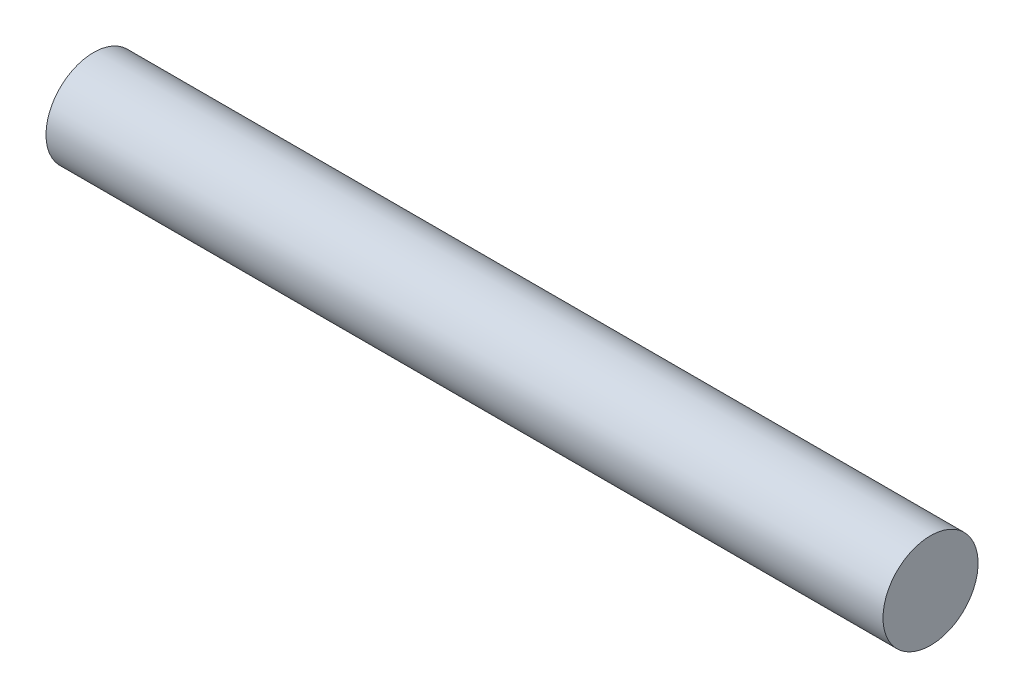
ISO-10303-21;
HEADER;
FILE_DESCRIPTION(('STEP AP214'),'2;1');
FILE_NAME('part.step','',(''),(''),'','','');
FILE_SCHEMA(('AUTOMOTIVE_DESIGN { 1 0 10303 214 1 1 1 1 }'));
ENDSEC;
DATA;
#1=APPLICATION_CONTEXT('core data for automotive mechanical design processes');
#2=APPLICATION_PROTOCOL_DEFINITION('international standard','automotive_design',2000,#1);
#3=PRODUCT_CONTEXT('',#1,'mechanical');
#4=PRODUCT('Part','Part','',(#3));
#5=PRODUCT_RELATED_PRODUCT_CATEGORY('part','',(#4));
#6=PRODUCT_DEFINITION_FORMATION('','',#4);
#7=PRODUCT_DEFINITION_CONTEXT('part definition',#1,'design');
#8=PRODUCT_DEFINITION('design','',#6,#7);
#9=PRODUCT_DEFINITION_SHAPE('','',#8);
#10=(LENGTH_UNIT() NAMED_UNIT(*) SI_UNIT(.MILLI.,.METRE.));
#11=(NAMED_UNIT(*) PLANE_ANGLE_UNIT() SI_UNIT($,.RADIAN.));
#12=(NAMED_UNIT(*) SI_UNIT($,.STERADIAN.) SOLID_ANGLE_UNIT());
#13=UNCERTAINTY_MEASURE_WITH_UNIT(LENGTH_MEASURE(1.E-05),#10,'distance_accuracy_value','');
#14=(GEOMETRIC_REPRESENTATION_CONTEXT(3) GLOBAL_UNCERTAINTY_ASSIGNED_CONTEXT((#13)) GLOBAL_UNIT_ASSIGNED_CONTEXT((#10,
#11,#12)) REPRESENTATION_CONTEXT('',''));
#15=CARTESIAN_POINT('',(0.,0.,0.));
#16=DIRECTION('',(0.,0.,1.));
#17=DIRECTION('',(1.,0.,0.));
#18=AXIS2_PLACEMENT_3D('',#15,#16,#17);
#19=CARTESIAN_POINT('',(44.,0.,0.));
#20=DIRECTION('',(-1.,0.,0.));
#21=DIRECTION('',(0.,0.,1.));
#22=AXIS2_PLACEMENT_3D('',#19,#20,#21);
#23=CYLINDRICAL_SURFACE('',#22,2.5);
#24=CARTESIAN_POINT('',(44.,0.,0.));
#25=DIRECTION('',(1.,0.,0.));
#26=DIRECTION('',(0.,0.,-1.));
#27=AXIS2_PLACEMENT_3D('',#24,#25,#26);
#28=CIRCLE('',#27,2.5);
#29=CARTESIAN_POINT('',(44.,0.,2.50000000000001));
#30=VERTEX_POINT('',#29);
#31=EDGE_CURVE('E12',#30,#30,#28,.T.);
#32=CARTESIAN_POINT('',(0.,0.,0.));
#33=DIRECTION('',(1.,0.,0.));
#34=DIRECTION('',(0.,0.,-1.));
#35=AXIS2_PLACEMENT_3D('',#32,#33,#34);
#36=CIRCLE('',#35,2.5);
#37=CARTESIAN_POINT('',(0.,0.,2.49999999999999));
#38=VERTEX_POINT('',#37);
#39=EDGE_CURVE('E47',#38,#38,#36,.T.);
#40=CARTESIAN_POINT('',(44.,0.,2.50000000000001));
#41=CARTESIAN_POINT('',(43.5416666666667,0.,2.50000000000001));
#42=CARTESIAN_POINT('',(43.0833333333333,0.,2.50000000000001));
#43=CARTESIAN_POINT('',(42.1666666666667,0.,2.50000000000001));
#44=CARTESIAN_POINT('',(41.7083333333333,0.,2.50000000000001));
#45=CARTESIAN_POINT('',(40.7916666666667,0.,2.50000000000001));
#46=CARTESIAN_POINT('',(40.3333333333333,0.,2.50000000000001));
#47=CARTESIAN_POINT('',(39.4166666666667,0.,2.50000000000001));
#48=CARTESIAN_POINT('',(38.9583333333333,0.,2.50000000000001));
#49=CARTESIAN_POINT('',(38.0416666666667,0.,2.50000000000001));
#50=CARTESIAN_POINT('',(37.5833333333333,0.,2.50000000000001));
#51=CARTESIAN_POINT('',(36.6666666666667,0.,2.50000000000001));
#52=CARTESIAN_POINT('',(36.2083333333333,0.,2.50000000000001));
#53=CARTESIAN_POINT('',(35.2916666666667,0.,2.50000000000001));
#54=CARTESIAN_POINT('',(34.8333333333333,0.,2.50000000000001));
#55=CARTESIAN_POINT('',(33.9166666666667,0.,2.50000000000001));
#56=CARTESIAN_POINT('',(33.4583333333333,0.,2.50000000000001));
#57=CARTESIAN_POINT('',(32.5416666666667,0.,2.50000000000001));
#58=CARTESIAN_POINT('',(32.0833333333333,0.,2.50000000000001));
#59=CARTESIAN_POINT('',(31.1666666666667,0.,2.50000000000001));
#60=CARTESIAN_POINT('',(30.7083333333333,0.,2.50000000000001));
#61=CARTESIAN_POINT('',(29.7916666666667,0.,2.50000000000001));
#62=CARTESIAN_POINT('',(29.3333333333333,0.,2.50000000000001));
#63=CARTESIAN_POINT('',(28.4166666666667,0.,2.50000000000001));
#64=CARTESIAN_POINT('',(27.9583333333333,0.,2.50000000000001));
#65=CARTESIAN_POINT('',(27.0416666666667,0.,2.50000000000001));
#66=CARTESIAN_POINT('',(26.5833333333333,0.,2.50000000000001));
#67=CARTESIAN_POINT('',(25.6666666666667,0.,2.50000000000001));
#68=CARTESIAN_POINT('',(25.2083333333333,0.,2.50000000000001));
#69=CARTESIAN_POINT('',(24.2916666666667,0.,2.5));
#70=CARTESIAN_POINT('',(23.8333333333333,0.,2.5));
#71=CARTESIAN_POINT('',(22.9166666666667,0.,2.5));
#72=CARTESIAN_POINT('',(22.4583333333333,0.,2.5));
#73=CARTESIAN_POINT('',(21.5416666666667,0.,2.5));
#74=CARTESIAN_POINT('',(21.0833333333333,0.,2.5));
#75=CARTESIAN_POINT('',(20.1666666666667,0.,2.5));
#76=CARTESIAN_POINT('',(19.7083333333333,0.,2.5));
#77=CARTESIAN_POINT('',(18.7916666666667,0.,2.5));
#78=CARTESIAN_POINT('',(18.3333333333333,0.,2.5));
#79=CARTESIAN_POINT('',(17.4166666666667,0.,2.5));
#80=CARTESIAN_POINT('',(16.9583333333333,0.,2.5));
#81=CARTESIAN_POINT('',(16.0416666666667,0.,2.5));
#82=CARTESIAN_POINT('',(15.5833333333333,0.,2.5));
#83=CARTESIAN_POINT('',(14.6666666666667,0.,2.5));
#84=CARTESIAN_POINT('',(14.2083333333333,0.,2.5));
#85=CARTESIAN_POINT('',(13.2916666666667,0.,2.5));
#86=CARTESIAN_POINT('',(12.8333333333333,0.,2.5));
#87=CARTESIAN_POINT('',(11.9166666666667,0.,2.5));
#88=CARTESIAN_POINT('',(11.4583333333333,0.,2.5));
#89=CARTESIAN_POINT('',(10.5416666666667,0.,2.5));
#90=CARTESIAN_POINT('',(10.0833333333333,0.,2.5));
#91=CARTESIAN_POINT('',(9.16666666666666,0.,2.5));
#92=CARTESIAN_POINT('',(8.70833333333333,0.,2.5));
#93=CARTESIAN_POINT('',(7.79166666666666,0.,2.5));
#94=CARTESIAN_POINT('',(7.33333333333333,0.,2.5));
#95=CARTESIAN_POINT('',(6.41666666666666,0.,2.5));
#96=CARTESIAN_POINT('',(5.95833333333333,0.,2.5));
#97=CARTESIAN_POINT('',(5.04166666666666,0.,2.5));
#98=CARTESIAN_POINT('',(4.58333333333333,0.,2.5));
#99=CARTESIAN_POINT('',(3.66666666666666,0.,2.5));
#100=CARTESIAN_POINT('',(3.20833333333333,0.,2.5));
#101=CARTESIAN_POINT('',(2.29166666666666,0.,2.5));
#102=CARTESIAN_POINT('',(1.83333333333333,0.,2.5));
#103=CARTESIAN_POINT('',(0.916666666666661,0.,2.49999999999999));
#104=CARTESIAN_POINT('',(0.458333333333327,0.,2.49999999999999));
#105=CARTESIAN_POINT('',(0.,0.,2.49999999999999));
#106=B_SPLINE_CURVE_WITH_KNOTS('',3,(#40,#41,#42,#43,#44,#45,#46,#47,#48,#49,#50,#51,#52,#53,
#54,#55,#56,#57,#58,#59,#60,#61,#62,#63,#64,#65,#66,#67,#68,#69,#70,#71,#72,#73,#74,#75,#76,#77,
#78,#79,#80,#81,#82,#83,#84,#85,#86,#87,#88,#89,#90,#91,#92,#93,#94,#95,#96,#97,#98,#99,#100,
#101,#102,#103,#104,#105),.UNSPECIFIED.,.F.,.F.,(4,2,2,2,2,2,2,2,2,2,2,2,2,2,2,2,2,2,2,2,2,2,2,
2,2,2,2,2,2,2,2,2,4),(0.,1.375,2.75,4.125,5.50000000000001,6.87500000000001,8.25000000000001,
9.625,11.,12.375,13.75,15.125,16.5,17.875,19.25,20.625,22.,23.375,24.75,26.125,27.5,28.875,
30.25,31.625,33.,34.375,35.75,37.125,38.5,39.875,41.25,42.625,44.),.UNSPECIFIED.);
#107=EDGE_CURVE('BSEAM44',#30,#38,#106,.T.);
#108=ORIENTED_EDGE('',*,*,#31,.F.);
#109=ORIENTED_EDGE('',*,*,#39,.T.);
#110=ORIENTED_EDGE('',*,*,#107,.T.);
#111=ORIENTED_EDGE('',*,*,#107,.F.);
#112=EDGE_LOOP('',(#108,#110,#109,#111));
#113=FACE_BOUND('',#112,.T.);
#114=ADVANCED_FACE('F44',(#113),#23,.T.);
#115=CARTESIAN_POINT('',(44.,0.,0.));
#116=DIRECTION('',(1.,0.,0.));
#117=DIRECTION('',(0.,0.,-1.));
#118=AXIS2_PLACEMENT_3D('',#115,#116,#117);
#119=PLANE('',#118);
#120=ORIENTED_EDGE('',*,*,#31,.T.);
#121=EDGE_LOOP('',(#120));
#122=FACE_BOUND('',#121,.T.);
#123=ADVANCED_FACE('F63',(#122),#119,.T.);
#124=CARTESIAN_POINT('',(0.,0.,0.));
#125=DIRECTION('',(1.,0.,0.));
#126=DIRECTION('',(0.,0.,-1.));
#127=AXIS2_PLACEMENT_3D('',#124,#125,#126);
#128=PLANE('',#127);
#129=ORIENTED_EDGE('',*,*,#39,.F.);
#130=EDGE_LOOP('',(#129));
#131=FACE_BOUND('',#130,.T.);
#132=ADVANCED_FACE('F61',(#131),#128,.F.);
#133=CLOSED_SHELL('',(#114,#123,#132));
#134=MANIFOLD_SOLID_BREP('B2',#133);
#135=ADVANCED_BREP_SHAPE_REPRESENTATION('',(#18,#134),#14);
#136=SHAPE_DEFINITION_REPRESENTATION(#9,#135);
ENDSEC;
END-ISO-10303-21;
